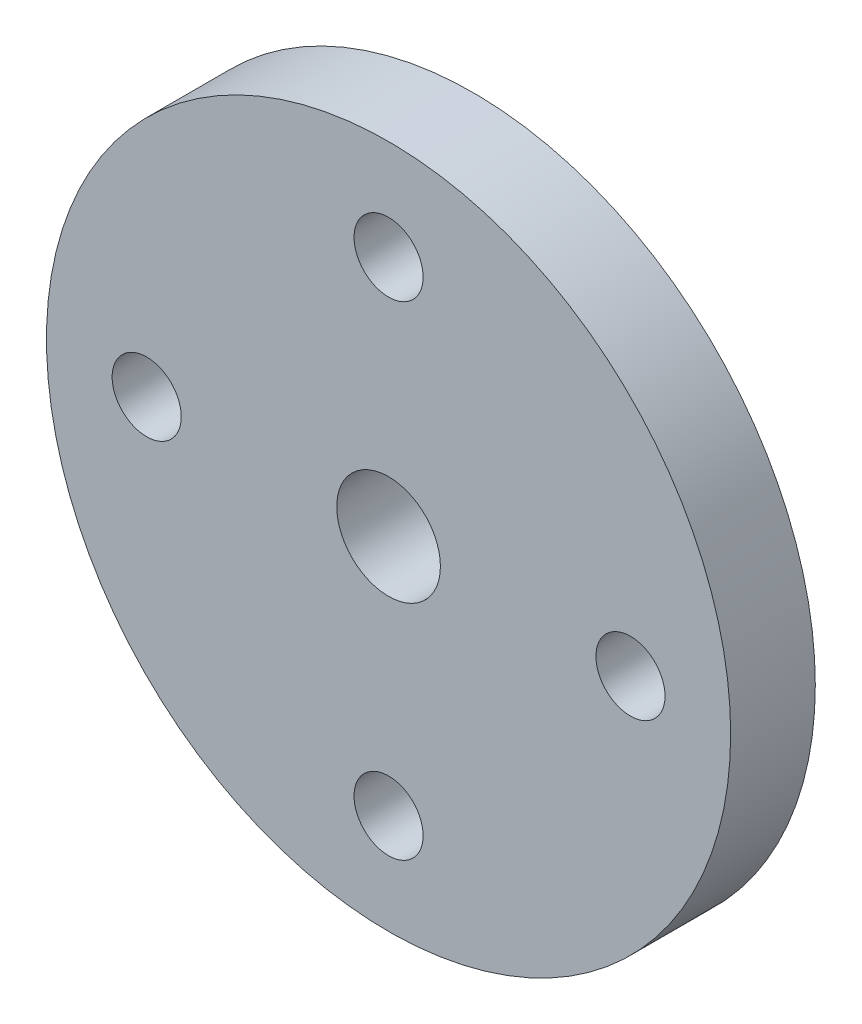
ISO-10303-21;
HEADER;
FILE_DESCRIPTION(('STEP AP214'),'2;1');
FILE_NAME('part.step','',(''),(''),'','','');
FILE_SCHEMA(('AUTOMOTIVE_DESIGN { 1 0 10303 214 1 1 1 1 }'));
ENDSEC;
DATA;
#1=APPLICATION_CONTEXT('core data for automotive mechanical design processes');
#2=APPLICATION_PROTOCOL_DEFINITION('international standard','automotive_design',2000,#1);
#3=PRODUCT_CONTEXT('',#1,'mechanical');
#4=PRODUCT('Part','Part','',(#3));
#5=PRODUCT_RELATED_PRODUCT_CATEGORY('part','',(#4));
#6=PRODUCT_DEFINITION_FORMATION('','',#4);
#7=PRODUCT_DEFINITION_CONTEXT('part definition',#1,'design');
#8=PRODUCT_DEFINITION('design','',#6,#7);
#9=PRODUCT_DEFINITION_SHAPE('','',#8);
#10=(LENGTH_UNIT() NAMED_UNIT(*) SI_UNIT(.MILLI.,.METRE.));
#11=(NAMED_UNIT(*) PLANE_ANGLE_UNIT() SI_UNIT($,.RADIAN.));
#12=(NAMED_UNIT(*) SI_UNIT($,.STERADIAN.) SOLID_ANGLE_UNIT());
#13=UNCERTAINTY_MEASURE_WITH_UNIT(LENGTH_MEASURE(1.E-05),#10,'distance_accuracy_value','');
#14=(GEOMETRIC_REPRESENTATION_CONTEXT(3) GLOBAL_UNCERTAINTY_ASSIGNED_CONTEXT((#13)) GLOBAL_UNIT_ASSIGNED_CONTEXT((#10,
#11,#12)) REPRESENTATION_CONTEXT('',''));
#15=CARTESIAN_POINT('',(0.,0.,0.));
#16=DIRECTION('',(0.,0.,1.));
#17=DIRECTION('',(1.,0.,0.));
#18=AXIS2_PLACEMENT_3D('',#15,#16,#17);
#19=CARTESIAN_POINT('',(0.,0.,2.45));
#20=DIRECTION('',(0.,0.,-1.));
#21=DIRECTION('',(-1.,0.,0.));
#22=AXIS2_PLACEMENT_3D('',#19,#20,#21);
#23=CYLINDRICAL_SURFACE('',#22,9.9);
#24=CARTESIAN_POINT('',(0.,0.,2.45));
#25=DIRECTION('',(0.,0.,1.));
#26=DIRECTION('',(1.,0.,0.));
#27=AXIS2_PLACEMENT_3D('',#24,#25,#26);
#28=CIRCLE('',#27,9.9);
#29=CARTESIAN_POINT('',(9.9,0.,2.45));
#30=VERTEX_POINT('',#29);
#31=EDGE_CURVE('E10',#30,#30,#28,.T.);
#32=ORIENTED_EDGE('',*,*,#31,.F.);
#33=EDGE_LOOP('',(#32));
#34=FACE_BOUND('',#33,.T.);
#35=CARTESIAN_POINT('',(0.,0.,0.));
#36=DIRECTION('',(0.,0.,1.));
#37=DIRECTION('',(1.,0.,0.));
#38=AXIS2_PLACEMENT_3D('',#35,#36,#37);
#39=CIRCLE('',#38,9.9);
#40=CARTESIAN_POINT('',(9.9,0.,0.));
#41=VERTEX_POINT('',#40);
#42=EDGE_CURVE('E42',#41,#41,#39,.T.);
#43=ORIENTED_EDGE('',*,*,#42,.T.);
#44=EDGE_LOOP('',(#43));
#45=FACE_BOUND('',#44,.T.);
#46=ADVANCED_FACE('F35',(#34,#45),#23,.T.);
#47=CARTESIAN_POINT('',(0.,0.,2.45));
#48=DIRECTION('',(0.,0.,1.));
#49=DIRECTION('',(1.,0.,0.));
#50=AXIS2_PLACEMENT_3D('',#47,#48,#49);
#51=PLANE('',#50);
#52=CARTESIAN_POINT('',(7.,0.,2.45));
#53=DIRECTION('',(0.,0.,1.));
#54=DIRECTION('',(1.,0.,0.));
#55=AXIS2_PLACEMENT_3D('',#52,#53,#54);
#56=CIRCLE('',#55,1.);
#57=CARTESIAN_POINT('',(8.,0.,2.45));
#58=VERTEX_POINT('',#57);
#59=EDGE_CURVE('E135',#58,#58,#56,.T.);
#60=ORIENTED_EDGE('',*,*,#59,.F.);
#61=EDGE_LOOP('',(#60));
#62=FACE_BOUND('',#61,.T.);
#63=CARTESIAN_POINT('',(0.,-7.,2.45));
#64=DIRECTION('',(0.,0.,1.));
#65=DIRECTION('',(1.,0.,0.));
#66=AXIS2_PLACEMENT_3D('',#63,#64,#65);
#67=CIRCLE('',#66,1.);
#68=CARTESIAN_POINT('',(0.999999999999977,-7.,2.45));
#69=VERTEX_POINT('',#68);
#70=EDGE_CURVE('E133',#69,#69,#67,.T.);
#71=ORIENTED_EDGE('',*,*,#70,.F.);
#72=EDGE_LOOP('',(#71));
#73=FACE_BOUND('',#72,.T.);
#74=CARTESIAN_POINT('',(-7.,0.,2.45));
#75=DIRECTION('',(0.,0.,1.));
#76=DIRECTION('',(1.,0.,0.));
#77=AXIS2_PLACEMENT_3D('',#74,#75,#76);
#78=CIRCLE('',#77,1.);
#79=CARTESIAN_POINT('',(-6.,0.,2.45));
#80=VERTEX_POINT('',#79);
#81=EDGE_CURVE('E136',#80,#80,#78,.T.);
#82=ORIENTED_EDGE('',*,*,#81,.F.);
#83=EDGE_LOOP('',(#82));
#84=FACE_BOUND('',#83,.T.);
#85=CARTESIAN_POINT('',(0.,7.,2.45));
#86=DIRECTION('',(0.,0.,1.));
#87=DIRECTION('',(1.,0.,0.));
#88=AXIS2_PLACEMENT_3D('',#85,#86,#87);
#89=CIRCLE('',#88,1.);
#90=CARTESIAN_POINT('',(1.00000000000007,7.,2.45));
#91=VERTEX_POINT('',#90);
#92=EDGE_CURVE('E142',#91,#91,#89,.T.);
#93=ORIENTED_EDGE('',*,*,#92,.F.);
#94=EDGE_LOOP('',(#93));
#95=FACE_BOUND('',#94,.T.);
#96=CARTESIAN_POINT('',(0.,0.,2.45));
#97=DIRECTION('',(0.,0.,1.));
#98=DIRECTION('',(1.,0.,0.));
#99=AXIS2_PLACEMENT_3D('',#96,#97,#98);
#100=CIRCLE('',#99,1.5);
#101=CARTESIAN_POINT('',(1.5,0.,2.45));
#102=VERTEX_POINT('',#101);
#103=EDGE_CURVE('E139',#102,#102,#100,.T.);
#104=ORIENTED_EDGE('',*,*,#103,.F.);
#105=EDGE_LOOP('',(#104));
#106=FACE_BOUND('',#105,.T.);
#107=ORIENTED_EDGE('',*,*,#31,.T.);
#108=EDGE_LOOP('',(#107));
#109=FACE_BOUND('',#108,.T.);
#110=ADVANCED_FACE('F90',(#62,#73,#84,#95,#106,#109),#51,.T.);
#111=CARTESIAN_POINT('',(0.,0.,0.));
#112=DIRECTION('',(0.,0.,1.));
#113=DIRECTION('',(1.,0.,0.));
#114=AXIS2_PLACEMENT_3D('',#111,#112,#113);
#115=PLANE('',#114);
#116=CARTESIAN_POINT('',(7.,0.,0.));
#117=DIRECTION('',(0.,0.,1.));
#118=DIRECTION('',(1.,0.,0.));
#119=AXIS2_PLACEMENT_3D('',#116,#117,#118);
#120=CIRCLE('',#119,1.);
#121=CARTESIAN_POINT('',(8.,0.,0.));
#122=VERTEX_POINT('',#121);
#123=EDGE_CURVE('E38',#122,#122,#120,.T.);
#124=ORIENTED_EDGE('',*,*,#123,.T.);
#125=EDGE_LOOP('',(#124));
#126=FACE_BOUND('',#125,.T.);
#127=CARTESIAN_POINT('',(0.,-7.,0.));
#128=DIRECTION('',(0.,0.,1.));
#129=DIRECTION('',(1.,0.,0.));
#130=AXIS2_PLACEMENT_3D('',#127,#128,#129);
#131=CIRCLE('',#130,1.);
#132=CARTESIAN_POINT('',(0.999999999999977,-7.,0.));
#133=VERTEX_POINT('',#132);
#134=EDGE_CURVE('E61',#133,#133,#131,.T.);
#135=ORIENTED_EDGE('',*,*,#134,.T.);
#136=EDGE_LOOP('',(#135));
#137=FACE_BOUND('',#136,.T.);
#138=CARTESIAN_POINT('',(-7.,0.,0.));
#139=DIRECTION('',(0.,0.,1.));
#140=DIRECTION('',(1.,0.,0.));
#141=AXIS2_PLACEMENT_3D('',#138,#139,#140);
#142=CIRCLE('',#141,1.);
#143=CARTESIAN_POINT('',(-6.,0.,0.));
#144=VERTEX_POINT('',#143);
#145=EDGE_CURVE('E58',#144,#144,#142,.T.);
#146=ORIENTED_EDGE('',*,*,#145,.T.);
#147=EDGE_LOOP('',(#146));
#148=FACE_BOUND('',#147,.T.);
#149=CARTESIAN_POINT('',(0.,7.,0.));
#150=DIRECTION('',(0.,0.,1.));
#151=DIRECTION('',(1.,0.,0.));
#152=AXIS2_PLACEMENT_3D('',#149,#150,#151);
#153=CIRCLE('',#152,1.);
#154=CARTESIAN_POINT('',(1.00000000000007,7.,0.));
#155=VERTEX_POINT('',#154);
#156=EDGE_CURVE('E55',#155,#155,#153,.T.);
#157=ORIENTED_EDGE('',*,*,#156,.T.);
#158=EDGE_LOOP('',(#157));
#159=FACE_BOUND('',#158,.T.);
#160=CARTESIAN_POINT('',(0.,0.,0.));
#161=DIRECTION('',(0.,0.,1.));
#162=DIRECTION('',(1.,0.,0.));
#163=AXIS2_PLACEMENT_3D('',#160,#161,#162);
#164=CIRCLE('',#163,4.5);
#165=CARTESIAN_POINT('',(4.5,0.,0.));
#166=VERTEX_POINT('',#165);
#167=EDGE_CURVE('E47',#166,#166,#164,.T.);
#168=ORIENTED_EDGE('',*,*,#167,.T.);
#169=EDGE_LOOP('',(#168));
#170=FACE_BOUND('',#169,.T.);
#171=ORIENTED_EDGE('',*,*,#42,.F.);
#172=EDGE_LOOP('',(#171));
#173=FACE_BOUND('',#172,.T.);
#174=ADVANCED_FACE('F86',(#126,#137,#148,#159,#170,#173),#115,.F.);
#175=CARTESIAN_POINT('',(0.,0.,-2.05));
#176=DIRECTION('',(0.,0.,1.));
#177=DIRECTION('',(1.,0.,0.));
#178=AXIS2_PLACEMENT_3D('',#175,#176,#177);
#179=CYLINDRICAL_SURFACE('',#178,4.5);
#180=CARTESIAN_POINT('',(0.,0.,-2.05));
#181=DIRECTION('',(0.,0.,1.));
#182=DIRECTION('',(1.,0.,0.));
#183=AXIS2_PLACEMENT_3D('',#180,#181,#182);
#184=CIRCLE('',#183,4.5);
#185=CARTESIAN_POINT('',(4.5,0.,-2.05));
#186=VERTEX_POINT('',#185);
#187=EDGE_CURVE('E50',#186,#186,#184,.T.);
#188=ORIENTED_EDGE('',*,*,#187,.T.);
#189=EDGE_LOOP('',(#188));
#190=FACE_BOUND('',#189,.T.);
#191=ORIENTED_EDGE('',*,*,#167,.F.);
#192=EDGE_LOOP('',(#191));
#193=FACE_BOUND('',#192,.T.);
#194=ADVANCED_FACE('F71',(#190,#193),#179,.T.);
#195=CARTESIAN_POINT('',(0.,0.,-2.05));
#196=DIRECTION('',(0.,0.,1.));
#197=DIRECTION('',(1.,0.,0.));
#198=AXIS2_PLACEMENT_3D('',#195,#196,#197);
#199=PLANE('',#198);
#200=CARTESIAN_POINT('',(0.,0.,-2.05));
#201=DIRECTION('',(0.,0.,1.));
#202=DIRECTION('',(1.,0.,0.));
#203=AXIS2_PLACEMENT_3D('',#200,#201,#202);
#204=CIRCLE('',#203,1.5);
#205=CARTESIAN_POINT('',(1.5,0.,-2.05));
#206=VERTEX_POINT('',#205);
#207=EDGE_CURVE('E59',#206,#206,#204,.T.);
#208=ORIENTED_EDGE('',*,*,#207,.T.);
#209=EDGE_LOOP('',(#208));
#210=FACE_BOUND('',#209,.T.);
#211=ORIENTED_EDGE('',*,*,#187,.F.);
#212=EDGE_LOOP('',(#211));
#213=FACE_BOUND('',#212,.T.);
#214=ADVANCED_FACE('F74',(#210,#213),#199,.F.);
#215=CARTESIAN_POINT('',(0.,0.,-2.05));
#216=DIRECTION('',(0.,0.,1.));
#217=DIRECTION('',(1.,0.,0.));
#218=AXIS2_PLACEMENT_3D('',#215,#216,#217);
#219=CYLINDRICAL_SURFACE('',#218,1.5);
#220=ORIENTED_EDGE('',*,*,#207,.F.);
#221=EDGE_LOOP('',(#220));
#222=FACE_BOUND('',#221,.T.);
#223=ORIENTED_EDGE('',*,*,#103,.T.);
#224=EDGE_LOOP('',(#223));
#225=FACE_BOUND('',#224,.T.);
#226=ADVANCED_FACE('F76',(#222,#225),#219,.F.);
#227=CARTESIAN_POINT('',(0.,7.,-2.05));
#228=DIRECTION('',(0.,0.,1.));
#229=DIRECTION('',(1.,0.,0.));
#230=AXIS2_PLACEMENT_3D('',#227,#228,#229);
#231=CYLINDRICAL_SURFACE('',#230,1.);
#232=ORIENTED_EDGE('',*,*,#92,.T.);
#233=EDGE_LOOP('',(#232));
#234=FACE_BOUND('',#233,.T.);
#235=ORIENTED_EDGE('',*,*,#156,.F.);
#236=EDGE_LOOP('',(#235));
#237=FACE_BOUND('',#236,.T.);
#238=ADVANCED_FACE('F83',(#234,#237),#231,.F.);
#239=CARTESIAN_POINT('',(-7.,0.,-2.05));
#240=DIRECTION('',(0.,0.,1.));
#241=DIRECTION('',(1.,0.,0.));
#242=AXIS2_PLACEMENT_3D('',#239,#240,#241);
#243=CYLINDRICAL_SURFACE('',#242,1.);
#244=ORIENTED_EDGE('',*,*,#81,.T.);
#245=EDGE_LOOP('',(#244));
#246=FACE_BOUND('',#245,.T.);
#247=ORIENTED_EDGE('',*,*,#145,.F.);
#248=EDGE_LOOP('',(#247));
#249=FACE_BOUND('',#248,.T.);
#250=ADVANCED_FACE('F111',(#246,#249),#243,.F.);
#251=CARTESIAN_POINT('',(0.,-7.,-2.05));
#252=DIRECTION('',(0.,0.,1.));
#253=DIRECTION('',(1.,0.,0.));
#254=AXIS2_PLACEMENT_3D('',#251,#252,#253);
#255=CYLINDRICAL_SURFACE('',#254,1.);
#256=ORIENTED_EDGE('',*,*,#70,.T.);
#257=EDGE_LOOP('',(#256));
#258=FACE_BOUND('',#257,.T.);
#259=ORIENTED_EDGE('',*,*,#134,.F.);
#260=EDGE_LOOP('',(#259));
#261=FACE_BOUND('',#260,.T.);
#262=ADVANCED_FACE('F117',(#258,#261),#255,.F.);
#263=CARTESIAN_POINT('',(7.,0.,-2.05));
#264=DIRECTION('',(0.,0.,1.));
#265=DIRECTION('',(1.,0.,0.));
#266=AXIS2_PLACEMENT_3D('',#263,#264,#265);
#267=CYLINDRICAL_SURFACE('',#266,1.);
#268=ORIENTED_EDGE('',*,*,#59,.T.);
#269=EDGE_LOOP('',(#268));
#270=FACE_BOUND('',#269,.T.);
#271=ORIENTED_EDGE('',*,*,#123,.F.);
#272=EDGE_LOOP('',(#271));
#273=FACE_BOUND('',#272,.T.);
#274=ADVANCED_FACE('F122',(#270,#273),#267,.F.);
#275=CLOSED_SHELL('',(#46,#110,#174,#194,#214,#226,#238,#250,#262,#274));
#276=MANIFOLD_SOLID_BREP('B2',#275);
#277=ADVANCED_BREP_SHAPE_REPRESENTATION('',(#18,#276),#14);
#278=SHAPE_DEFINITION_REPRESENTATION(#9,#277);
ENDSEC;
END-ISO-10303-21;
